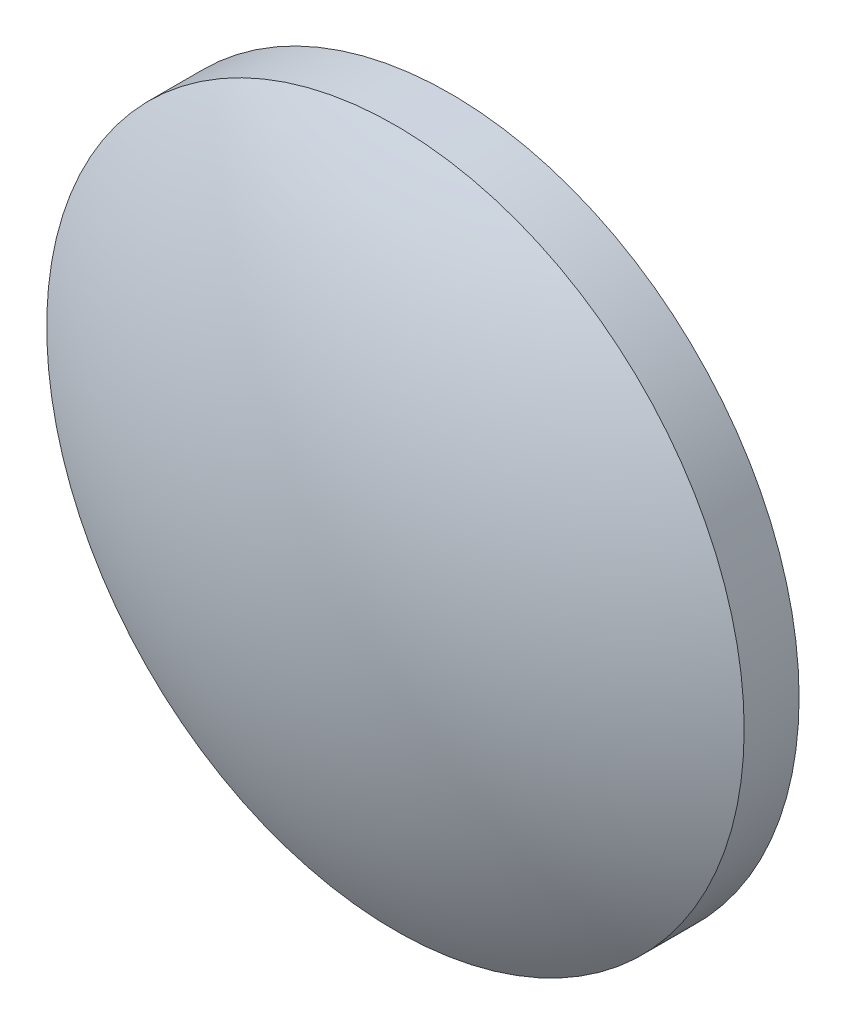
ISO-10303-21;
HEADER;
FILE_DESCRIPTION(('STEP AP214'),'2;1');
FILE_NAME('part.step','',(''),(''),'','','');
FILE_SCHEMA(('AUTOMOTIVE_DESIGN { 1 0 10303 214 1 1 1 1 }'));
ENDSEC;
DATA;
#1=APPLICATION_CONTEXT('core data for automotive mechanical design processes');
#2=APPLICATION_PROTOCOL_DEFINITION('international standard','automotive_design',2000,#1);
#3=PRODUCT_CONTEXT('',#1,'mechanical');
#4=PRODUCT('Part','Part','',(#3));
#5=PRODUCT_RELATED_PRODUCT_CATEGORY('part','',(#4));
#6=PRODUCT_DEFINITION_FORMATION('','',#4);
#7=PRODUCT_DEFINITION_CONTEXT('part definition',#1,'design');
#8=PRODUCT_DEFINITION('design','',#6,#7);
#9=PRODUCT_DEFINITION_SHAPE('','',#8);
#10=(LENGTH_UNIT() NAMED_UNIT(*) SI_UNIT(.MILLI.,.METRE.));
#11=(NAMED_UNIT(*) PLANE_ANGLE_UNIT() SI_UNIT($,.RADIAN.));
#12=(NAMED_UNIT(*) SI_UNIT($,.STERADIAN.) SOLID_ANGLE_UNIT());
#13=UNCERTAINTY_MEASURE_WITH_UNIT(LENGTH_MEASURE(1.E-05),#10,'distance_accuracy_value','');
#14=(GEOMETRIC_REPRESENTATION_CONTEXT(3) GLOBAL_UNCERTAINTY_ASSIGNED_CONTEXT((#13)) GLOBAL_UNIT_ASSIGNED_CONTEXT((#10,
#11,#12)) REPRESENTATION_CONTEXT('',''));
#15=CARTESIAN_POINT('',(0.,0.,0.));
#16=DIRECTION('',(0.,0.,1.));
#17=DIRECTION('',(1.,0.,0.));
#18=AXIS2_PLACEMENT_3D('',#15,#16,#17);
#19=CARTESIAN_POINT('',(0.,0.,2.));
#20=DIRECTION('',(0.,0.,-1.));
#21=DIRECTION('',(-1.,0.,0.));
#22=AXIS2_PLACEMENT_3D('',#19,#20,#21);
#23=CYLINDRICAL_SURFACE('',#22,12.7);
#24=CARTESIAN_POINT('',(0.,0.,2.));
#25=DIRECTION('',(0.,0.,1.));
#26=DIRECTION('',(1.,0.,0.));
#27=AXIS2_PLACEMENT_3D('',#24,#25,#26);
#28=CIRCLE('',#27,12.7);
#29=CARTESIAN_POINT('',(12.7,0.,2.));
#30=VERTEX_POINT('',#29);
#31=EDGE_CURVE('E10',#30,#30,#28,.T.);
#32=ORIENTED_EDGE('',*,*,#31,.F.);
#33=EDGE_LOOP('',(#32));
#34=FACE_BOUND('',#33,.T.);
#35=CARTESIAN_POINT('',(0.,0.,0.));
#36=DIRECTION('',(0.,0.,1.));
#37=DIRECTION('',(1.,0.,0.));
#38=AXIS2_PLACEMENT_3D('',#35,#36,#37);
#39=CIRCLE('',#38,12.7);
#40=CARTESIAN_POINT('',(12.7,0.,0.));
#41=VERTEX_POINT('',#40);
#42=EDGE_CURVE('E42',#41,#41,#39,.T.);
#43=ORIENTED_EDGE('',*,*,#42,.T.);
#44=EDGE_LOOP('',(#43));
#45=FACE_BOUND('',#44,.T.);
#46=ADVANCED_FACE('F35',(#34,#45),#23,.T.);
#47=CARTESIAN_POINT('',(0.,0.,-19.2914285714286));
#48=DIRECTION('',(0.,0.,1.));
#49=DIRECTION('',(1.,0.,0.));
#50=AXIS2_PLACEMENT_3D('',#47,#48,#49);
#51=SPHERICAL_SURFACE('',#50,24.7914285714286);
#52=ORIENTED_EDGE('',*,*,#31,.T.);
#53=EDGE_LOOP('',(#52));
#54=FACE_BOUND('',#53,.T.);
#55=ADVANCED_FACE('F37',(#54),#51,.T.);
#56=CARTESIAN_POINT('',(0.,0.,0.));
#57=DIRECTION('',(0.,0.,1.));
#58=DIRECTION('',(1.,0.,0.));
#59=AXIS2_PLACEMENT_3D('',#56,#57,#58);
#60=PLANE('',#59);
#61=ORIENTED_EDGE('',*,*,#42,.F.);
#62=EDGE_LOOP('',(#61));
#63=FACE_BOUND('',#62,.T.);
#64=ADVANCED_FACE('F49',(#63),#60,.F.);
#65=CLOSED_SHELL('',(#46,#55,#64));
#66=MANIFOLD_SOLID_BREP('B2',#65);
#67=ADVANCED_BREP_SHAPE_REPRESENTATION('',(#18,#66),#14);
#68=SHAPE_DEFINITION_REPRESENTATION(#9,#67);
ENDSEC;
END-ISO-10303-21;
